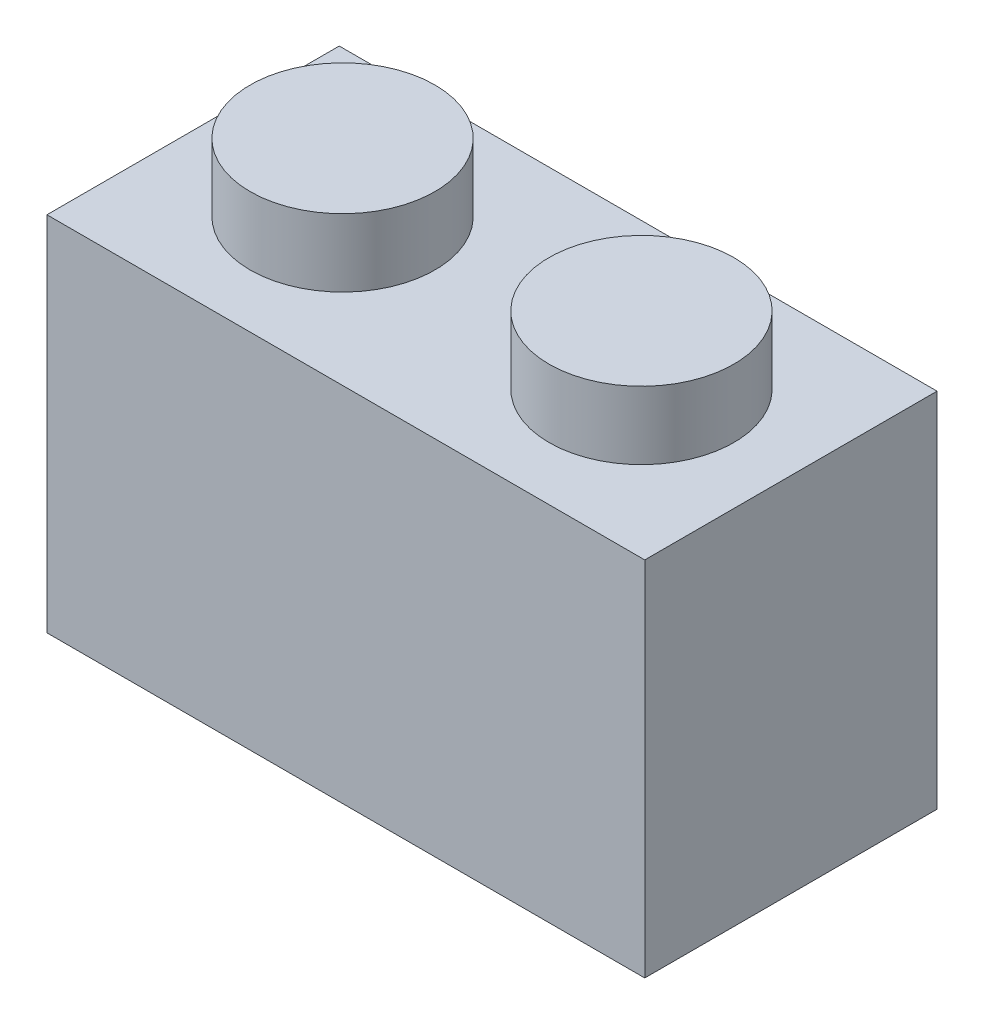
ISO-10303-21;
HEADER;
FILE_DESCRIPTION(('STEP AP214'),'2;1');
FILE_NAME('part.step','',(''),(''),'','','');
FILE_SCHEMA(('AUTOMOTIVE_DESIGN { 1 0 10303 214 1 1 1 1 }'));
ENDSEC;
DATA;
#1=APPLICATION_CONTEXT('core data for automotive mechanical design processes');
#2=APPLICATION_PROTOCOL_DEFINITION('international standard','automotive_design',2000,#1);
#3=PRODUCT_CONTEXT('',#1,'mechanical');
#4=PRODUCT('Part','Part','',(#3));
#5=PRODUCT_RELATED_PRODUCT_CATEGORY('part','',(#4));
#6=PRODUCT_DEFINITION_FORMATION('','',#4);
#7=PRODUCT_DEFINITION_CONTEXT('part definition',#1,'design');
#8=PRODUCT_DEFINITION('design','',#6,#7);
#9=PRODUCT_DEFINITION_SHAPE('','',#8);
#10=(LENGTH_UNIT() NAMED_UNIT(*) SI_UNIT(.MILLI.,.METRE.));
#11=(NAMED_UNIT(*) PLANE_ANGLE_UNIT() SI_UNIT($,.RADIAN.));
#12=(NAMED_UNIT(*) SI_UNIT($,.STERADIAN.) SOLID_ANGLE_UNIT());
#13=UNCERTAINTY_MEASURE_WITH_UNIT(LENGTH_MEASURE(1.E-05),#10,'distance_accuracy_value','');
#14=(GEOMETRIC_REPRESENTATION_CONTEXT(3) GLOBAL_UNCERTAINTY_ASSIGNED_CONTEXT((#13)) GLOBAL_UNIT_ASSIGNED_CONTEXT((#10,
#11,#12)) REPRESENTATION_CONTEXT('',''));
#15=CARTESIAN_POINT('',(0.,0.,0.));
#16=DIRECTION('',(0.,0.,1.));
#17=DIRECTION('',(1.,0.,0.));
#18=AXIS2_PLACEMENT_3D('',#15,#16,#17);
#19=CARTESIAN_POINT('',(7.925,-9.6,-3.875));
#20=DIRECTION('',(1.,0.,0.));
#21=DIRECTION('',(0.,0.,-1.));
#22=AXIS2_PLACEMENT_3D('',#19,#20,#21);
#23=PLANE('',#22);
#24=DIRECTION('',(0.,0.,-1.));
#25=VECTOR('',#24,1.);
#26=CARTESIAN_POINT('',(7.925,0.,-3.875));
#27=LINE('',#26,#25);
#28=CARTESIAN_POINT('',(7.925,0.,3.875));
#29=VERTEX_POINT('',#28);
#30=CARTESIAN_POINT('',(7.925,0.,-3.875));
#31=VERTEX_POINT('',#30);
#32=EDGE_CURVE('E170',#29,#31,#27,.T.);
#33=ORIENTED_EDGE('',*,*,#32,.F.);
#34=DIRECTION('',(0.,1.,0.));
#35=VECTOR('',#34,1.);
#36=CARTESIAN_POINT('',(7.925,-9.6,3.875));
#37=LINE('',#36,#35);
#38=CARTESIAN_POINT('',(7.925,-9.6,3.875));
#39=VERTEX_POINT('',#38);
#40=EDGE_CURVE('E42',#39,#29,#37,.T.);
#41=ORIENTED_EDGE('',*,*,#40,.F.);
#42=DIRECTION('',(0.,0.,-1.));
#43=VECTOR('',#42,1.);
#44=CARTESIAN_POINT('',(7.925,-9.6,-3.875));
#45=LINE('',#44,#43);
#46=CARTESIAN_POINT('',(7.925,-9.6,-3.875));
#47=VERTEX_POINT('',#46);
#48=EDGE_CURVE('E173',#39,#47,#45,.T.);
#49=ORIENTED_EDGE('',*,*,#48,.T.);
#50=DIRECTION('',(0.,1.,0.));
#51=VECTOR('',#50,1.);
#52=CARTESIAN_POINT('',(7.925,-9.6,-3.875));
#53=LINE('',#52,#51);
#54=EDGE_CURVE('E83',#47,#31,#53,.T.);
#55=ORIENTED_EDGE('',*,*,#54,.T.);
#56=EDGE_LOOP('',(#33,#41,#49,#55));
#57=FACE_BOUND('',#56,.T.);
#58=ADVANCED_FACE('F35',(#57),#23,.T.);
#59=CARTESIAN_POINT('',(-7.925,-9.6,3.875));
#60=DIRECTION('',(0.,0.,1.));
#61=DIRECTION('',(1.,0.,0.));
#62=AXIS2_PLACEMENT_3D('',#59,#60,#61);
#63=PLANE('',#62);
#64=DIRECTION('',(1.,0.,0.));
#65=VECTOR('',#64,1.);
#66=CARTESIAN_POINT('',(-7.925,0.,3.875));
#67=LINE('',#66,#65);
#68=CARTESIAN_POINT('',(-7.925,0.,3.875));
#69=VERTEX_POINT('',#68);
#70=EDGE_CURVE('E176',#69,#29,#67,.T.);
#71=ORIENTED_EDGE('',*,*,#70,.F.);
#72=DIRECTION('',(0.,1.,0.));
#73=VECTOR('',#72,1.);
#74=CARTESIAN_POINT('',(-7.925,-9.6,3.875));
#75=LINE('',#74,#73);
#76=CARTESIAN_POINT('',(-7.925,-9.6,3.875));
#77=VERTEX_POINT('',#76);
#78=EDGE_CURVE('E194',#77,#69,#75,.T.);
#79=ORIENTED_EDGE('',*,*,#78,.F.);
#80=DIRECTION('',(1.,0.,0.));
#81=VECTOR('',#80,1.);
#82=CARTESIAN_POINT('',(-7.925,-9.6,3.875));
#83=LINE('',#82,#81);
#84=EDGE_CURVE('E181',#77,#39,#83,.T.);
#85=ORIENTED_EDGE('',*,*,#84,.T.);
#86=ORIENTED_EDGE('',*,*,#40,.T.);
#87=EDGE_LOOP('',(#71,#79,#85,#86));
#88=FACE_BOUND('',#87,.T.);
#89=ADVANCED_FACE('F201',(#88),#63,.T.);
#90=CARTESIAN_POINT('',(-7.925,-9.6,-3.875));
#91=DIRECTION('',(-1.,0.,0.));
#92=DIRECTION('',(0.,0.,1.));
#93=AXIS2_PLACEMENT_3D('',#90,#91,#92);
#94=PLANE('',#93);
#95=DIRECTION('',(0.,0.,1.));
#96=VECTOR('',#95,1.);
#97=CARTESIAN_POINT('',(-7.925,0.,-3.875));
#98=LINE('',#97,#96);
#99=CARTESIAN_POINT('',(-7.925,0.,-3.875));
#100=VERTEX_POINT('',#99);
#101=EDGE_CURVE('E188',#100,#69,#98,.T.);
#102=ORIENTED_EDGE('',*,*,#101,.F.);
#103=DIRECTION('',(0.,1.,0.));
#104=VECTOR('',#103,1.);
#105=CARTESIAN_POINT('',(-7.925,-9.6,-3.875));
#106=LINE('',#105,#104);
#107=CARTESIAN_POINT('',(-7.925,-9.6,-3.875));
#108=VERTEX_POINT('',#107);
#109=EDGE_CURVE('E196',#108,#100,#106,.T.);
#110=ORIENTED_EDGE('',*,*,#109,.F.);
#111=DIRECTION('',(0.,0.,1.));
#112=VECTOR('',#111,1.);
#113=CARTESIAN_POINT('',(-7.925,-9.6,-3.875));
#114=LINE('',#113,#112);
#115=EDGE_CURVE('E178',#108,#77,#114,.T.);
#116=ORIENTED_EDGE('',*,*,#115,.T.);
#117=ORIENTED_EDGE('',*,*,#78,.T.);
#118=EDGE_LOOP('',(#102,#110,#116,#117));
#119=FACE_BOUND('',#118,.T.);
#120=ADVANCED_FACE('F205',(#119),#94,.T.);
#121=CARTESIAN_POINT('',(-7.925,-9.6,-3.875));
#122=DIRECTION('',(0.,0.,-1.));
#123=DIRECTION('',(-1.,0.,0.));
#124=AXIS2_PLACEMENT_3D('',#121,#122,#123);
#125=PLANE('',#124);
#126=DIRECTION('',(-1.,0.,0.));
#127=VECTOR('',#126,1.);
#128=CARTESIAN_POINT('',(-7.925,0.,-3.875));
#129=LINE('',#128,#127);
#130=EDGE_CURVE('E185',#31,#100,#129,.T.);
#131=ORIENTED_EDGE('',*,*,#130,.F.);
#132=ORIENTED_EDGE('',*,*,#54,.F.);
#133=DIRECTION('',(-1.,0.,0.));
#134=VECTOR('',#133,1.);
#135=CARTESIAN_POINT('',(-7.925,-9.6,-3.875));
#136=LINE('',#135,#134);
#137=EDGE_CURVE('E175',#47,#108,#136,.T.);
#138=ORIENTED_EDGE('',*,*,#137,.T.);
#139=ORIENTED_EDGE('',*,*,#109,.T.);
#140=EDGE_LOOP('',(#131,#132,#138,#139));
#141=FACE_BOUND('',#140,.T.);
#142=ADVANCED_FACE('F197',(#141),#125,.T.);
#143=CARTESIAN_POINT('',(0.,-9.6,0.));
#144=DIRECTION('',(0.,1.,0.));
#145=DIRECTION('',(0.,0.,1.));
#146=AXIS2_PLACEMENT_3D('',#143,#144,#145);
#147=PLANE('',#146);
#148=DIRECTION('',(1.,0.,0.));
#149=VECTOR('',#148,1.);
#150=CARTESIAN_POINT('',(0.,-9.6,2.375));
#151=LINE('',#150,#149);
#152=CARTESIAN_POINT('',(-6.425,-9.6,2.375));
#153=VERTEX_POINT('',#152);
#154=CARTESIAN_POINT('',(6.425,-9.6,2.375));
#155=VERTEX_POINT('',#154);
#156=EDGE_CURVE('E156',#153,#155,#151,.T.);
#157=ORIENTED_EDGE('',*,*,#156,.T.);
#158=DIRECTION('',(0.,0.,-1.));
#159=VECTOR('',#158,1.);
#160=CARTESIAN_POINT('',(6.425,-9.6,0.));
#161=LINE('',#160,#159);
#162=CARTESIAN_POINT('',(6.425,-9.6,-2.375));
#163=VERTEX_POINT('',#162);
#164=EDGE_CURVE('E112',#155,#163,#161,.T.);
#165=ORIENTED_EDGE('',*,*,#164,.T.);
#166=DIRECTION('',(-1.,0.,0.));
#167=VECTOR('',#166,1.);
#168=CARTESIAN_POINT('',(0.,-9.6,-2.375));
#169=LINE('',#168,#167);
#170=CARTESIAN_POINT('',(-6.425,-9.6,-2.375));
#171=VERTEX_POINT('',#170);
#172=EDGE_CURVE('E134',#163,#171,#169,.T.);
#173=ORIENTED_EDGE('',*,*,#172,.T.);
#174=DIRECTION('',(0.,0.,1.));
#175=VECTOR('',#174,1.);
#176=CARTESIAN_POINT('',(-6.425,-9.6,0.));
#177=LINE('',#176,#175);
#178=EDGE_CURVE('E49',#171,#153,#177,.T.);
#179=ORIENTED_EDGE('',*,*,#178,.T.);
#180=EDGE_LOOP('',(#157,#165,#173,#179));
#181=FACE_BOUND('',#180,.T.);
#182=ORIENTED_EDGE('',*,*,#48,.F.);
#183=ORIENTED_EDGE('',*,*,#84,.F.);
#184=ORIENTED_EDGE('',*,*,#115,.F.);
#185=ORIENTED_EDGE('',*,*,#137,.F.);
#186=EDGE_LOOP('',(#182,#183,#184,#185));
#187=FACE_BOUND('',#186,.T.);
#188=ADVANCED_FACE('F207',(#181,#187),#147,.F.);
#189=CARTESIAN_POINT('',(0.,0.,0.));
#190=DIRECTION('',(0.,1.,0.));
#191=DIRECTION('',(0.,0.,1.));
#192=AXIS2_PLACEMENT_3D('',#189,#190,#191);
#193=PLANE('',#192);
#194=CARTESIAN_POINT('',(3.9625,0.,0.));
#195=DIRECTION('',(0.,1.,0.));
#196=DIRECTION('',(0.,0.,1.));
#197=AXIS2_PLACEMENT_3D('',#194,#195,#196);
#198=CIRCLE('',#197,2.45);
#199=CARTESIAN_POINT('',(3.9625,0.,2.45));
#200=VERTEX_POINT('',#199);
#201=EDGE_CURVE('E117',#200,#200,#198,.T.);
#202=ORIENTED_EDGE('',*,*,#201,.F.);
#203=EDGE_LOOP('',(#202));
#204=FACE_BOUND('',#203,.T.);
#205=CARTESIAN_POINT('',(-3.9625,0.,0.));
#206=DIRECTION('',(0.,1.,0.));
#207=DIRECTION('',(0.,0.,1.));
#208=AXIS2_PLACEMENT_3D('',#205,#206,#207);
#209=CIRCLE('',#208,2.45);
#210=CARTESIAN_POINT('',(-3.9625,0.,2.45));
#211=VERTEX_POINT('',#210);
#212=EDGE_CURVE('E164',#211,#211,#209,.T.);
#213=ORIENTED_EDGE('',*,*,#212,.F.);
#214=EDGE_LOOP('',(#213));
#215=FACE_BOUND('',#214,.T.);
#216=ORIENTED_EDGE('',*,*,#32,.T.);
#217=ORIENTED_EDGE('',*,*,#130,.T.);
#218=ORIENTED_EDGE('',*,*,#101,.T.);
#219=ORIENTED_EDGE('',*,*,#70,.T.);
#220=EDGE_LOOP('',(#216,#217,#218,#219));
#221=FACE_BOUND('',#220,.T.);
#222=ADVANCED_FACE('F200',(#204,#215,#221),#193,.T.);
#223=CARTESIAN_POINT('',(-3.9625,1.8,0.));
#224=DIRECTION('',(0.,-1.,0.));
#225=DIRECTION('',(0.,0.,-1.));
#226=AXIS2_PLACEMENT_3D('',#223,#224,#225);
#227=CYLINDRICAL_SURFACE('',#226,2.45);
#228=CARTESIAN_POINT('',(-3.9625,1.8,0.));
#229=DIRECTION('',(0.,1.,0.));
#230=DIRECTION('',(0.,0.,1.));
#231=AXIS2_PLACEMENT_3D('',#228,#229,#230);
#232=CIRCLE('',#231,2.45);
#233=CARTESIAN_POINT('',(-3.9625,1.8,2.45));
#234=VERTEX_POINT('',#233);
#235=EDGE_CURVE('E167',#234,#234,#232,.T.);
#236=ORIENTED_EDGE('',*,*,#235,.F.);
#237=EDGE_LOOP('',(#236));
#238=FACE_BOUND('',#237,.T.);
#239=ORIENTED_EDGE('',*,*,#212,.T.);
#240=EDGE_LOOP('',(#239));
#241=FACE_BOUND('',#240,.T.);
#242=ADVANCED_FACE('F215',(#238,#241),#227,.T.);
#243=CARTESIAN_POINT('',(-3.9625,1.8,0.));
#244=DIRECTION('',(0.,1.,0.));
#245=DIRECTION('',(0.,0.,1.));
#246=AXIS2_PLACEMENT_3D('',#243,#244,#245);
#247=PLANE('',#246);
#248=ORIENTED_EDGE('',*,*,#235,.T.);
#249=EDGE_LOOP('',(#248));
#250=FACE_BOUND('',#249,.T.);
#251=ADVANCED_FACE('F250',(#250),#247,.T.);
#252=CARTESIAN_POINT('',(3.9625,1.8,0.));
#253=DIRECTION('',(0.,-1.,0.));
#254=DIRECTION('',(0.,0.,-1.));
#255=AXIS2_PLACEMENT_3D('',#252,#253,#254);
#256=CYLINDRICAL_SURFACE('',#255,2.45);
#257=CARTESIAN_POINT('',(3.9625,1.8,0.));
#258=DIRECTION('',(0.,1.,0.));
#259=DIRECTION('',(0.,0.,1.));
#260=AXIS2_PLACEMENT_3D('',#257,#258,#259);
#261=CIRCLE('',#260,2.45);
#262=CARTESIAN_POINT('',(3.9625,1.8,2.45));
#263=VERTEX_POINT('',#262);
#264=EDGE_CURVE('E161',#263,#263,#261,.T.);
#265=ORIENTED_EDGE('',*,*,#264,.F.);
#266=EDGE_LOOP('',(#265));
#267=FACE_BOUND('',#266,.T.);
#268=ORIENTED_EDGE('',*,*,#201,.T.);
#269=EDGE_LOOP('',(#268));
#270=FACE_BOUND('',#269,.T.);
#271=ADVANCED_FACE('F259',(#267,#270),#256,.T.);
#272=CARTESIAN_POINT('',(3.9625,1.8,0.));
#273=DIRECTION('',(0.,1.,0.));
#274=DIRECTION('',(0.,0.,1.));
#275=AXIS2_PLACEMENT_3D('',#272,#273,#274);
#276=PLANE('',#275);
#277=ORIENTED_EDGE('',*,*,#264,.T.);
#278=EDGE_LOOP('',(#277));
#279=FACE_BOUND('',#278,.T.);
#280=ADVANCED_FACE('F269',(#279),#276,.T.);
#281=CARTESIAN_POINT('',(6.425,-9.6,-3.875));
#282=DIRECTION('',(1.,0.,0.));
#283=DIRECTION('',(0.,0.,-1.));
#284=AXIS2_PLACEMENT_3D('',#281,#282,#283);
#285=PLANE('',#284);
#286=DIRECTION('',(0.,0.,-1.));
#287=VECTOR('',#286,1.);
#288=CARTESIAN_POINT('',(6.425,-1.5,0.));
#289=LINE('',#288,#287);
#290=CARTESIAN_POINT('',(6.425,-1.5,2.375));
#291=VERTEX_POINT('',#290);
#292=CARTESIAN_POINT('',(6.425,-1.5,-2.375));
#293=VERTEX_POINT('',#292);
#294=EDGE_CURVE('E110',#291,#293,#289,.T.);
#295=ORIENTED_EDGE('',*,*,#294,.T.);
#296=DIRECTION('',(0.,1.,0.));
#297=VECTOR('',#296,1.);
#298=CARTESIAN_POINT('',(6.425,-9.6,-2.375));
#299=LINE('',#298,#297);
#300=EDGE_CURVE('E139',#163,#293,#299,.T.);
#301=ORIENTED_EDGE('',*,*,#300,.F.);
#302=ORIENTED_EDGE('',*,*,#164,.F.);
#303=DIRECTION('',(0.,1.,0.));
#304=VECTOR('',#303,1.);
#305=CARTESIAN_POINT('',(6.425,-9.6,2.375));
#306=LINE('',#305,#304);
#307=EDGE_CURVE('E107',#155,#291,#306,.T.);
#308=ORIENTED_EDGE('',*,*,#307,.T.);
#309=EDGE_LOOP('',(#295,#301,#302,#308));
#310=FACE_BOUND('',#309,.T.);
#311=ADVANCED_FACE('F109',(#310),#285,.F.);
#312=CARTESIAN_POINT('',(-7.925,-9.6,2.375));
#313=DIRECTION('',(0.,0.,1.));
#314=DIRECTION('',(1.,0.,0.));
#315=AXIS2_PLACEMENT_3D('',#312,#313,#314);
#316=PLANE('',#315);
#317=DIRECTION('',(1.,0.,0.));
#318=VECTOR('',#317,1.);
#319=CARTESIAN_POINT('',(0.,-1.5,2.375));
#320=LINE('',#319,#318);
#321=CARTESIAN_POINT('',(-6.425,-1.5,2.375));
#322=VERTEX_POINT('',#321);
#323=EDGE_CURVE('E125',#322,#291,#320,.T.);
#324=ORIENTED_EDGE('',*,*,#323,.T.);
#325=ORIENTED_EDGE('',*,*,#307,.F.);
#326=ORIENTED_EDGE('',*,*,#156,.F.);
#327=DIRECTION('',(0.,1.,0.));
#328=VECTOR('',#327,1.);
#329=CARTESIAN_POINT('',(-6.425,-9.6,2.375));
#330=LINE('',#329,#328);
#331=EDGE_CURVE('E118',#153,#322,#330,.T.);
#332=ORIENTED_EDGE('',*,*,#331,.T.);
#333=EDGE_LOOP('',(#324,#325,#326,#332));
#334=FACE_BOUND('',#333,.T.);
#335=ADVANCED_FACE('F130',(#334),#316,.F.);
#336=CARTESIAN_POINT('',(-6.425,-9.6,-3.875));
#337=DIRECTION('',(-1.,0.,0.));
#338=DIRECTION('',(0.,0.,1.));
#339=AXIS2_PLACEMENT_3D('',#336,#337,#338);
#340=PLANE('',#339);
#341=DIRECTION('',(0.,0.,1.));
#342=VECTOR('',#341,1.);
#343=CARTESIAN_POINT('',(-6.425,-1.5,0.));
#344=LINE('',#343,#342);
#345=CARTESIAN_POINT('',(-6.425,-1.5,-2.375));
#346=VERTEX_POINT('',#345);
#347=EDGE_CURVE('E132',#346,#322,#344,.T.);
#348=ORIENTED_EDGE('',*,*,#347,.T.);
#349=ORIENTED_EDGE('',*,*,#331,.F.);
#350=ORIENTED_EDGE('',*,*,#178,.F.);
#351=DIRECTION('',(0.,1.,0.));
#352=VECTOR('',#351,1.);
#353=CARTESIAN_POINT('',(-6.425,-9.6,-2.375));
#354=LINE('',#353,#352);
#355=EDGE_CURVE('E140',#171,#346,#354,.T.);
#356=ORIENTED_EDGE('',*,*,#355,.T.);
#357=EDGE_LOOP('',(#348,#349,#350,#356));
#358=FACE_BOUND('',#357,.T.);
#359=ADVANCED_FACE('F299',(#358),#340,.F.);
#360=CARTESIAN_POINT('',(-7.925,-9.6,-2.375));
#361=DIRECTION('',(0.,0.,-1.));
#362=DIRECTION('',(-1.,0.,0.));
#363=AXIS2_PLACEMENT_3D('',#360,#361,#362);
#364=PLANE('',#363);
#365=DIRECTION('',(-1.,0.,0.));
#366=VECTOR('',#365,1.);
#367=CARTESIAN_POINT('',(0.,-1.5,-2.375));
#368=LINE('',#367,#366);
#369=EDGE_CURVE('E127',#293,#346,#368,.T.);
#370=ORIENTED_EDGE('',*,*,#369,.T.);
#371=ORIENTED_EDGE('',*,*,#355,.F.);
#372=ORIENTED_EDGE('',*,*,#172,.F.);
#373=ORIENTED_EDGE('',*,*,#300,.T.);
#374=EDGE_LOOP('',(#370,#371,#372,#373));
#375=FACE_BOUND('',#374,.T.);
#376=ADVANCED_FACE('F308',(#375),#364,.F.);
#377=CARTESIAN_POINT('',(0.,-1.5,0.));
#378=DIRECTION('',(0.,1.,0.));
#379=DIRECTION('',(0.,0.,1.));
#380=AXIS2_PLACEMENT_3D('',#377,#378,#379);
#381=PLANE('',#380);
#382=CARTESIAN_POINT('',(0.,-1.5,0.));
#383=DIRECTION('',(0.,1.,0.));
#384=DIRECTION('',(0.,0.,1.));
#385=AXIS2_PLACEMENT_3D('',#382,#383,#384);
#386=CIRCLE('',#385,1.5);
#387=CARTESIAN_POINT('',(0.,-1.5,1.5));
#388=VERTEX_POINT('',#387);
#389=EDGE_CURVE('E12',#388,#388,#386,.F.);
#390=ORIENTED_EDGE('',*,*,#389,.F.);
#391=EDGE_LOOP('',(#390));
#392=FACE_BOUND('',#391,.T.);
#393=CARTESIAN_POINT('',(3.9625,-1.5,0.));
#394=DIRECTION('',(0.,1.,0.));
#395=DIRECTION('',(0.,0.,1.));
#396=AXIS2_PLACEMENT_3D('',#393,#394,#395);
#397=CIRCLE('',#396,0.950000000000001);
#398=CARTESIAN_POINT('',(3.9625,-1.5,0.950000000000001));
#399=VERTEX_POINT('',#398);
#400=EDGE_CURVE('E144',#399,#399,#397,.T.);
#401=ORIENTED_EDGE('',*,*,#400,.T.);
#402=EDGE_LOOP('',(#401));
#403=FACE_BOUND('',#402,.T.);
#404=CARTESIAN_POINT('',(-3.9625,-1.5,0.));
#405=DIRECTION('',(0.,1.,0.));
#406=DIRECTION('',(0.,0.,1.));
#407=AXIS2_PLACEMENT_3D('',#404,#405,#406);
#408=CIRCLE('',#407,0.950000000000001);
#409=CARTESIAN_POINT('',(-3.9625,-1.5,0.950000000000001));
#410=VERTEX_POINT('',#409);
#411=EDGE_CURVE('E149',#410,#410,#408,.T.);
#412=ORIENTED_EDGE('',*,*,#411,.T.);
#413=EDGE_LOOP('',(#412));
#414=FACE_BOUND('',#413,.T.);
#415=ORIENTED_EDGE('',*,*,#294,.F.);
#416=ORIENTED_EDGE('',*,*,#323,.F.);
#417=ORIENTED_EDGE('',*,*,#347,.F.);
#418=ORIENTED_EDGE('',*,*,#369,.F.);
#419=EDGE_LOOP('',(#415,#416,#417,#418));
#420=FACE_BOUND('',#419,.T.);
#421=ADVANCED_FACE('F123',(#392,#403,#414,#420),#381,.F.);
#422=CARTESIAN_POINT('',(-3.9625,1.8,0.));
#423=DIRECTION('',(0.,-1.,0.));
#424=DIRECTION('',(0.,0.,-1.));
#425=AXIS2_PLACEMENT_3D('',#422,#423,#424);
#426=CYLINDRICAL_SURFACE('',#425,0.950000000000001);
#427=CARTESIAN_POINT('',(-3.9625,0.3,0.));
#428=DIRECTION('',(0.,1.,0.));
#429=DIRECTION('',(0.,0.,1.));
#430=AXIS2_PLACEMENT_3D('',#427,#428,#429);
#431=CIRCLE('',#430,0.950000000000001);
#432=CARTESIAN_POINT('',(-3.9625,0.3,0.950000000000001));
#433=VERTEX_POINT('',#432);
#434=EDGE_CURVE('E128',#433,#433,#431,.T.);
#435=ORIENTED_EDGE('',*,*,#434,.T.);
#436=EDGE_LOOP('',(#435));
#437=FACE_BOUND('',#436,.T.);
#438=ORIENTED_EDGE('',*,*,#411,.F.);
#439=EDGE_LOOP('',(#438));
#440=FACE_BOUND('',#439,.T.);
#441=ADVANCED_FACE('F324',(#437,#440),#426,.F.);
#442=CARTESIAN_POINT('',(-3.9625,0.3,0.));
#443=DIRECTION('',(0.,1.,0.));
#444=DIRECTION('',(0.,0.,1.));
#445=AXIS2_PLACEMENT_3D('',#442,#443,#444);
#446=PLANE('',#445);
#447=ORIENTED_EDGE('',*,*,#434,.F.);
#448=EDGE_LOOP('',(#447));
#449=FACE_BOUND('',#448,.T.);
#450=ADVANCED_FACE('F329',(#449),#446,.F.);
#451=CARTESIAN_POINT('',(3.9625,1.8,0.));
#452=DIRECTION('',(0.,-1.,0.));
#453=DIRECTION('',(0.,0.,-1.));
#454=AXIS2_PLACEMENT_3D('',#451,#452,#453);
#455=CYLINDRICAL_SURFACE('',#454,0.950000000000001);
#456=CARTESIAN_POINT('',(3.9625,0.3,0.));
#457=DIRECTION('',(0.,1.,0.));
#458=DIRECTION('',(0.,0.,1.));
#459=AXIS2_PLACEMENT_3D('',#456,#457,#458);
#460=CIRCLE('',#459,0.950000000000001);
#461=CARTESIAN_POINT('',(3.9625,0.3,0.950000000000001));
#462=VERTEX_POINT('',#461);
#463=EDGE_CURVE('E147',#462,#462,#460,.T.);
#464=ORIENTED_EDGE('',*,*,#463,.T.);
#465=EDGE_LOOP('',(#464));
#466=FACE_BOUND('',#465,.T.);
#467=ORIENTED_EDGE('',*,*,#400,.F.);
#468=EDGE_LOOP('',(#467));
#469=FACE_BOUND('',#468,.T.);
#470=ADVANCED_FACE('F339',(#466,#469),#455,.F.);
#471=CARTESIAN_POINT('',(3.9625,0.3,0.));
#472=DIRECTION('',(0.,1.,0.));
#473=DIRECTION('',(0.,0.,1.));
#474=AXIS2_PLACEMENT_3D('',#471,#472,#473);
#475=PLANE('',#474);
#476=ORIENTED_EDGE('',*,*,#463,.F.);
#477=EDGE_LOOP('',(#476));
#478=FACE_BOUND('',#477,.T.);
#479=ADVANCED_FACE('F349',(#478),#475,.F.);
#480=CARTESIAN_POINT('',(0.,-13.8426406871193,0.));
#481=DIRECTION('',(0.,1.,0.));
#482=DIRECTION('',(0.,0.,1.));
#483=AXIS2_PLACEMENT_3D('',#480,#481,#482);
#484=CYLINDRICAL_SURFACE('',#483,1.5);
#485=CARTESIAN_POINT('',(0.,-9.4,0.));
#486=DIRECTION('',(0.,1.,0.));
#487=DIRECTION('',(0.,0.,1.));
#488=AXIS2_PLACEMENT_3D('',#485,#486,#487);
#489=CIRCLE('',#488,1.5);
#490=CARTESIAN_POINT('',(0.,-9.4,1.5));
#491=VERTEX_POINT('',#490);
#492=EDGE_CURVE('E148',#491,#491,#489,.T.);
#493=ORIENTED_EDGE('',*,*,#492,.T.);
#494=EDGE_LOOP('',(#493));
#495=FACE_BOUND('',#494,.T.);
#496=ORIENTED_EDGE('',*,*,#389,.T.);
#497=EDGE_LOOP('',(#496));
#498=FACE_BOUND('',#497,.T.);
#499=ADVANCED_FACE('F359',(#495,#498),#484,.T.);
#500=CARTESIAN_POINT('',(0.,-9.4,0.));
#501=DIRECTION('',(0.,1.,0.));
#502=DIRECTION('',(0.,0.,1.));
#503=AXIS2_PLACEMENT_3D('',#500,#501,#502);
#504=PLANE('',#503);
#505=ORIENTED_EDGE('',*,*,#492,.F.);
#506=EDGE_LOOP('',(#505));
#507=FACE_BOUND('',#506,.T.);
#508=ADVANCED_FACE('F376',(#507),#504,.F.);
#509=CLOSED_SHELL('',(#58,#89,#120,#142,#188,#222,#242,#251,#271,#280,#311,#335,#359,#376,#421,
#441,#450,#470,#479,#499,#508));
#510=MANIFOLD_SOLID_BREP('B2',#509);
#511=ADVANCED_BREP_SHAPE_REPRESENTATION('',(#18,#510),#14);
#512=SHAPE_DEFINITION_REPRESENTATION(#9,#511);
ENDSEC;
END-ISO-10303-21;
